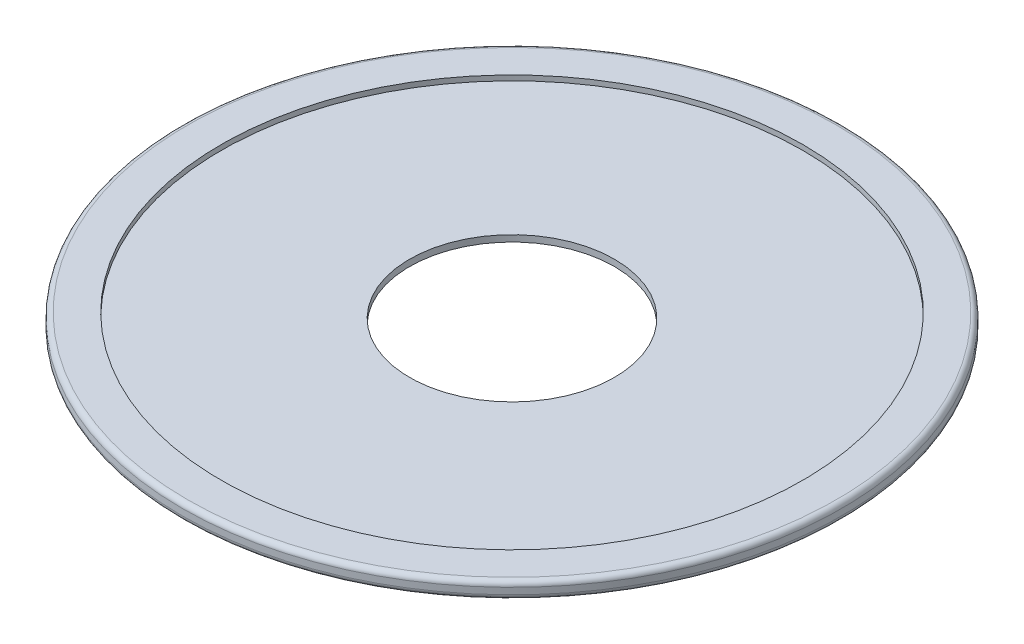
ISO-10303-21;
HEADER;
FILE_DESCRIPTION(('STEP AP214'),'2;1');
FILE_NAME('part.step','',(''),(''),'','','');
FILE_SCHEMA(('AUTOMOTIVE_DESIGN { 1 0 10303 214 1 1 1 1 }'));
ENDSEC;
DATA;
#1=APPLICATION_CONTEXT('core data for automotive mechanical design processes');
#2=APPLICATION_PROTOCOL_DEFINITION('international standard','automotive_design',2000,#1);
#3=PRODUCT_CONTEXT('',#1,'mechanical');
#4=PRODUCT('Part','Part','',(#3));
#5=PRODUCT_RELATED_PRODUCT_CATEGORY('part','',(#4));
#6=PRODUCT_DEFINITION_FORMATION('','',#4);
#7=PRODUCT_DEFINITION_CONTEXT('part definition',#1,'design');
#8=PRODUCT_DEFINITION('design','',#6,#7);
#9=PRODUCT_DEFINITION_SHAPE('','',#8);
#10=(LENGTH_UNIT() NAMED_UNIT(*) SI_UNIT(.MILLI.,.METRE.));
#11=(NAMED_UNIT(*) PLANE_ANGLE_UNIT() SI_UNIT($,.RADIAN.));
#12=(NAMED_UNIT(*) SI_UNIT($,.STERADIAN.) SOLID_ANGLE_UNIT());
#13=UNCERTAINTY_MEASURE_WITH_UNIT(LENGTH_MEASURE(1.E-05),#10,'distance_accuracy_value','');
#14=(GEOMETRIC_REPRESENTATION_CONTEXT(3) GLOBAL_UNCERTAINTY_ASSIGNED_CONTEXT((#13)) GLOBAL_UNIT_ASSIGNED_CONTEXT((#10,
#11,#12)) REPRESENTATION_CONTEXT('',''));
#15=CARTESIAN_POINT('',(0.,0.,0.));
#16=DIRECTION('',(0.,0.,1.));
#17=DIRECTION('',(1.,0.,0.));
#18=AXIS2_PLACEMENT_3D('',#15,#16,#17);
#19=CARTESIAN_POINT('',(0.,-187.080769230769,0.));
#20=DIRECTION('',(0.,-1.,0.));
#21=DIRECTION('',(0.,0.,-1.));
#22=AXIS2_PLACEMENT_3D('',#19,#20,#21);
#23=CYLINDRICAL_SURFACE('',#22,76.2);
#24=CARTESIAN_POINT('',(0.,0.,0.));
#25=DIRECTION('',(0.,-1.,0.));
#26=DIRECTION('',(0.,0.,-1.));
#27=AXIS2_PLACEMENT_3D('',#24,#25,#26);
#28=CIRCLE('',#27,76.2);
#29=CARTESIAN_POINT('',(0.,0.,-76.2));
#30=VERTEX_POINT('',#29);
#31=EDGE_CURVE('E48',#30,#30,#28,.T.);
#32=ORIENTED_EDGE('',*,*,#31,.T.);
#33=EDGE_LOOP('',(#32));
#34=FACE_BOUND('',#33,.T.);
#35=CARTESIAN_POINT('',(0.,4.7625,0.));
#36=DIRECTION('',(0.,-1.,0.));
#37=DIRECTION('',(0.,0.,-1.));
#38=AXIS2_PLACEMENT_3D('',#35,#36,#37);
#39=CIRCLE('',#38,76.2);
#40=CARTESIAN_POINT('',(0.,4.7625,-76.2));
#41=VERTEX_POINT('',#40);
#42=EDGE_CURVE('E44',#41,#41,#39,.T.);
#43=ORIENTED_EDGE('',*,*,#42,.F.);
#44=EDGE_LOOP('',(#43));
#45=FACE_BOUND('',#44,.T.);
#46=ADVANCED_FACE('F34',(#34,#45),#23,.F.);
#47=CARTESIAN_POINT('',(76.2,4.7625,0.));
#48=DIRECTION('',(0.,1.,0.));
#49=DIRECTION('',(0.,0.,1.));
#50=AXIS2_PLACEMENT_3D('',#47,#48,#49);
#51=PLANE('',#50);
#52=CARTESIAN_POINT('',(0.,4.7625,0.));
#53=DIRECTION('',(0.,1.,0.));
#54=DIRECTION('',(0.,0.,1.));
#55=AXIS2_PLACEMENT_3D('',#52,#53,#54);
#56=CIRCLE('',#55,216.3);
#57=CARTESIAN_POINT('',(0.,4.7625,216.3));
#58=VERTEX_POINT('',#57);
#59=EDGE_CURVE('E10',#58,#58,#56,.F.);
#60=ORIENTED_EDGE('',*,*,#59,.F.);
#61=EDGE_LOOP('',(#60));
#62=FACE_BOUND('',#61,.T.);
#63=ORIENTED_EDGE('',*,*,#42,.T.);
#64=EDGE_LOOP('',(#63));
#65=FACE_BOUND('',#64,.T.);
#66=ADVANCED_FACE('F84',(#62,#65),#51,.T.);
#67=CARTESIAN_POINT('',(76.2,0.,0.));
#68=DIRECTION('',(0.,-1.,0.));
#69=DIRECTION('',(0.,0.,-1.));
#70=AXIS2_PLACEMENT_3D('',#67,#68,#69);
#71=PLANE('',#70);
#72=CARTESIAN_POINT('',(0.,0.,0.));
#73=DIRECTION('',(0.,-1.,0.));
#74=DIRECTION('',(0.,0.,-1.));
#75=AXIS2_PLACEMENT_3D('',#72,#73,#74);
#76=CIRCLE('',#75,216.3);
#77=CARTESIAN_POINT('',(0.,0.,-216.3));
#78=VERTEX_POINT('',#77);
#79=EDGE_CURVE('E40',#78,#78,#76,.F.);
#80=ORIENTED_EDGE('',*,*,#79,.F.);
#81=EDGE_LOOP('',(#80));
#82=FACE_BOUND('',#81,.T.);
#83=ORIENTED_EDGE('',*,*,#31,.F.);
#84=EDGE_LOOP('',(#83));
#85=FACE_BOUND('',#84,.T.);
#86=ADVANCED_FACE('F89',(#82,#85),#71,.T.);
#87=CARTESIAN_POINT('',(0.,0.,0.));
#88=DIRECTION('',(0.,-1.,0.));
#89=DIRECTION('',(0.,0.,-1.));
#90=AXIS2_PLACEMENT_3D('',#87,#88,#89);
#91=CYLINDRICAL_SURFACE('',#90,216.3);
#92=CARTESIAN_POINT('',(0.,-3.81,0.));
#93=DIRECTION('',(0.,-1.,0.));
#94=DIRECTION('',(0.,0.,-1.));
#95=AXIS2_PLACEMENT_3D('',#92,#93,#94);
#96=CIRCLE('',#95,216.3);
#97=CARTESIAN_POINT('',(0.,-3.81,-216.3));
#98=VERTEX_POINT('',#97);
#99=EDGE_CURVE('E53',#98,#98,#96,.T.);
#100=ORIENTED_EDGE('',*,*,#99,.T.);
#101=EDGE_LOOP('',(#100));
#102=FACE_BOUND('',#101,.T.);
#103=ORIENTED_EDGE('',*,*,#79,.T.);
#104=EDGE_LOOP('',(#103));
#105=FACE_BOUND('',#104,.T.);
#106=ADVANCED_FACE('F97',(#102,#105),#91,.F.);
#107=CARTESIAN_POINT('',(216.3,-3.81,0.));
#108=DIRECTION('',(0.,-1.,0.));
#109=DIRECTION('',(0.,0.,-1.));
#110=AXIS2_PLACEMENT_3D('',#107,#108,#109);
#111=PLANE('',#110);
#112=CARTESIAN_POINT('',(0.,-3.81,0.));
#113=DIRECTION('',(0.,-1.,0.));
#114=DIRECTION('',(0.,0.,-1.));
#115=AXIS2_PLACEMENT_3D('',#112,#113,#114);
#116=CIRCLE('',#115,241.3);
#117=CARTESIAN_POINT('',(0.,-3.81,-241.3));
#118=VERTEX_POINT('',#117);
#119=EDGE_CURVE('E56',#118,#118,#116,.T.);
#120=ORIENTED_EDGE('',*,*,#119,.T.);
#121=EDGE_LOOP('',(#120));
#122=FACE_BOUND('',#121,.T.);
#123=ORIENTED_EDGE('',*,*,#99,.F.);
#124=EDGE_LOOP('',(#123));
#125=FACE_BOUND('',#124,.T.);
#126=ADVANCED_FACE('F103',(#122,#125),#111,.T.);
#127=CARTESIAN_POINT('',(0.,0.,0.));
#128=DIRECTION('',(0.,-1.,0.));
#129=DIRECTION('',(0.,0.,-1.));
#130=AXIS2_PLACEMENT_3D('',#127,#128,#129);
#131=TOROIDAL_SURFACE('',#130,241.3,3.81000000000002);
#132=CARTESIAN_POINT('',(0.,0.,0.));
#133=DIRECTION('',(0.,-1.,0.));
#134=DIRECTION('',(0.,0.,-1.));
#135=AXIS2_PLACEMENT_3D('',#132,#133,#134);
#136=CIRCLE('',#135,245.11);
#137=CARTESIAN_POINT('',(0.,0.,-245.11));
#138=VERTEX_POINT('',#137);
#139=EDGE_CURVE('E59',#138,#138,#136,.T.);
#140=ORIENTED_EDGE('',*,*,#139,.T.);
#141=EDGE_LOOP('',(#140));
#142=FACE_BOUND('',#141,.T.);
#143=ORIENTED_EDGE('',*,*,#119,.F.);
#144=EDGE_LOOP('',(#143));
#145=FACE_BOUND('',#144,.T.);
#146=ADVANCED_FACE('F109',(#142,#145),#131,.T.);
#147=CARTESIAN_POINT('',(0.,0.,0.));
#148=DIRECTION('',(0.,-1.,0.));
#149=DIRECTION('',(0.,0.,-1.));
#150=AXIS2_PLACEMENT_3D('',#147,#148,#149);
#151=CYLINDRICAL_SURFACE('',#150,245.11);
#152=CARTESIAN_POINT('',(0.,4.7625,0.));
#153=DIRECTION('',(0.,-1.,0.));
#154=DIRECTION('',(0.,0.,-1.));
#155=AXIS2_PLACEMENT_3D('',#152,#153,#154);
#156=CIRCLE('',#155,245.11);
#157=CARTESIAN_POINT('',(0.,4.7625,-245.11));
#158=VERTEX_POINT('',#157);
#159=EDGE_CURVE('E62',#158,#158,#156,.T.);
#160=ORIENTED_EDGE('',*,*,#159,.T.);
#161=EDGE_LOOP('',(#160));
#162=FACE_BOUND('',#161,.T.);
#163=ORIENTED_EDGE('',*,*,#139,.F.);
#164=EDGE_LOOP('',(#163));
#165=FACE_BOUND('',#164,.T.);
#166=ADVANCED_FACE('F113',(#162,#165),#151,.T.);
#167=CARTESIAN_POINT('',(0.,4.7625,0.));
#168=DIRECTION('',(0.,-1.,0.));
#169=DIRECTION('',(0.,0.,-1.));
#170=AXIS2_PLACEMENT_3D('',#167,#168,#169);
#171=TOROIDAL_SURFACE('',#170,241.3,3.81000000000001);
#172=CARTESIAN_POINT('',(0.,8.57250000000002,0.));
#173=DIRECTION('',(0.,-1.,0.));
#174=DIRECTION('',(0.,0.,-1.));
#175=AXIS2_PLACEMENT_3D('',#172,#173,#174);
#176=CIRCLE('',#175,241.3);
#177=CARTESIAN_POINT('',(0.,8.57250000000002,-241.3));
#178=VERTEX_POINT('',#177);
#179=EDGE_CURVE('E65',#178,#178,#176,.T.);
#180=ORIENTED_EDGE('',*,*,#179,.T.);
#181=EDGE_LOOP('',(#180));
#182=FACE_BOUND('',#181,.T.);
#183=ORIENTED_EDGE('',*,*,#159,.F.);
#184=EDGE_LOOP('',(#183));
#185=FACE_BOUND('',#184,.T.);
#186=ADVANCED_FACE('F81',(#182,#185),#171,.T.);
#187=CARTESIAN_POINT('',(241.3,8.5725,0.));
#188=DIRECTION('',(0.,1.,0.));
#189=DIRECTION('',(0.,0.,1.));
#190=AXIS2_PLACEMENT_3D('',#187,#188,#189);
#191=PLANE('',#190);
#192=CARTESIAN_POINT('',(0.,8.57249999999999,0.));
#193=DIRECTION('',(0.,-1.,0.));
#194=DIRECTION('',(0.,0.,-1.));
#195=AXIS2_PLACEMENT_3D('',#192,#193,#194);
#196=CIRCLE('',#195,216.3);
#197=CARTESIAN_POINT('',(0.,8.57249999999999,-216.3));
#198=VERTEX_POINT('',#197);
#199=EDGE_CURVE('E68',#198,#198,#196,.T.);
#200=ORIENTED_EDGE('',*,*,#199,.T.);
#201=EDGE_LOOP('',(#200));
#202=FACE_BOUND('',#201,.T.);
#203=ORIENTED_EDGE('',*,*,#179,.F.);
#204=EDGE_LOOP('',(#203));
#205=FACE_BOUND('',#204,.T.);
#206=ADVANCED_FACE('F72',(#202,#205),#191,.T.);
#207=CARTESIAN_POINT('',(0.,0.,0.));
#208=DIRECTION('',(0.,-1.,0.));
#209=DIRECTION('',(0.,0.,-1.));
#210=AXIS2_PLACEMENT_3D('',#207,#208,#209);
#211=CYLINDRICAL_SURFACE('',#210,216.3);
#212=ORIENTED_EDGE('',*,*,#59,.T.);
#213=EDGE_LOOP('',(#212));
#214=FACE_BOUND('',#213,.T.);
#215=ORIENTED_EDGE('',*,*,#199,.F.);
#216=EDGE_LOOP('',(#215));
#217=FACE_BOUND('',#216,.T.);
#218=ADVANCED_FACE('F75',(#214,#217),#211,.F.);
#219=CLOSED_SHELL('',(#46,#66,#86,#106,#126,#146,#166,#186,#206,#218));
#220=MANIFOLD_SOLID_BREP('B2',#219);
#221=ADVANCED_BREP_SHAPE_REPRESENTATION('',(#18,#220),#14);
#222=SHAPE_DEFINITION_REPRESENTATION(#9,#221);
ENDSEC;
END-ISO-10303-21;
